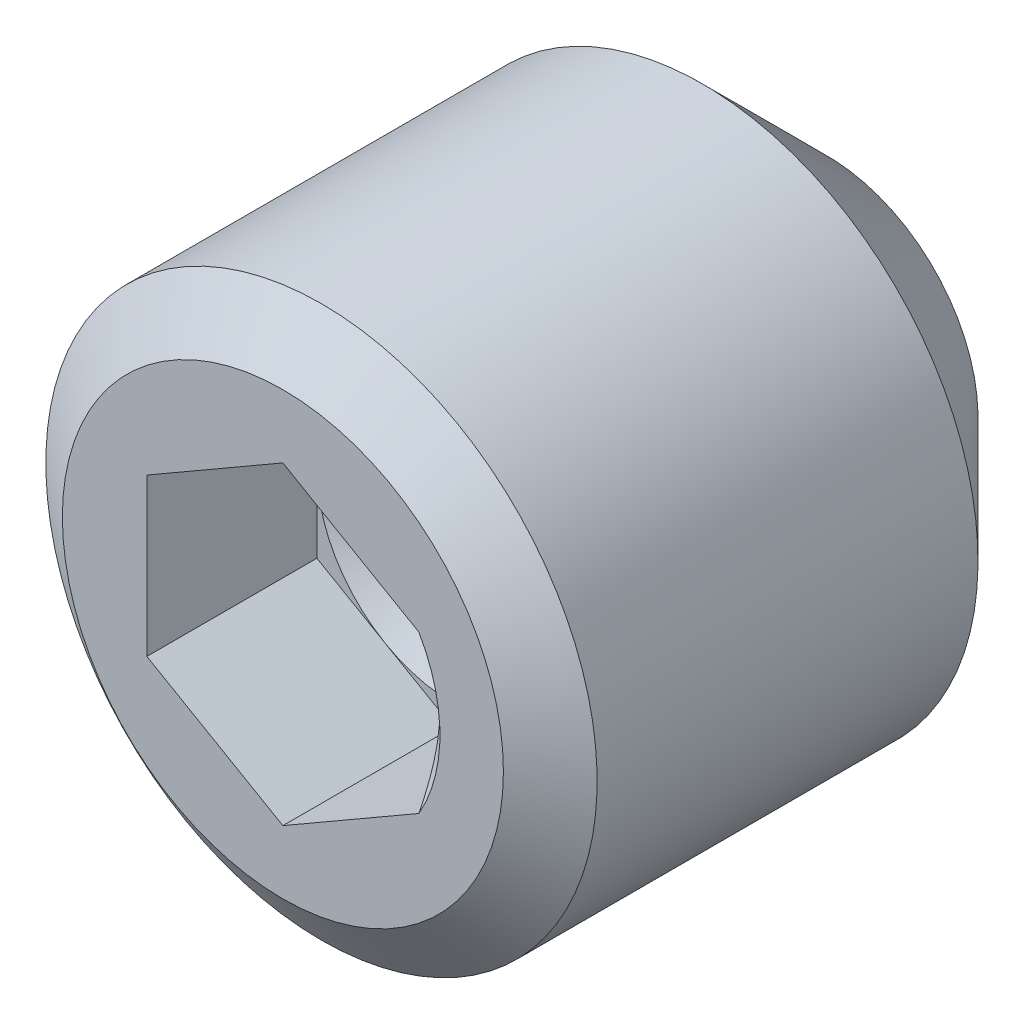
ISO-10303-21;
HEADER;
FILE_DESCRIPTION(('STEP AP214'),'2;1');
FILE_NAME('part.step','',(''),(''),'','','');
FILE_SCHEMA(('AUTOMOTIVE_DESIGN { 1 0 10303 214 1 1 1 1 }'));
ENDSEC;
DATA;
#1=APPLICATION_CONTEXT('core data for automotive mechanical design processes');
#2=APPLICATION_PROTOCOL_DEFINITION('international standard','automotive_design',2000,#1);
#3=PRODUCT_CONTEXT('',#1,'mechanical');
#4=PRODUCT('Part','Part','',(#3));
#5=PRODUCT_RELATED_PRODUCT_CATEGORY('part','',(#4));
#6=PRODUCT_DEFINITION_FORMATION('','',#4);
#7=PRODUCT_DEFINITION_CONTEXT('part definition',#1,'design');
#8=PRODUCT_DEFINITION('design','',#6,#7);
#9=PRODUCT_DEFINITION_SHAPE('','',#8);
#10=(LENGTH_UNIT() NAMED_UNIT(*) SI_UNIT(.MILLI.,.METRE.));
#11=(NAMED_UNIT(*) PLANE_ANGLE_UNIT() SI_UNIT($,.RADIAN.));
#12=(NAMED_UNIT(*) SI_UNIT($,.STERADIAN.) SOLID_ANGLE_UNIT());
#13=UNCERTAINTY_MEASURE_WITH_UNIT(LENGTH_MEASURE(1.E-05),#10,'distance_accuracy_value','');
#14=(GEOMETRIC_REPRESENTATION_CONTEXT(3) GLOBAL_UNCERTAINTY_ASSIGNED_CONTEXT((#13)) GLOBAL_UNIT_ASSIGNED_CONTEXT((#10,
#11,#12)) REPRESENTATION_CONTEXT('',''));
#15=CARTESIAN_POINT('',(0.,0.,0.));
#16=DIRECTION('',(0.,0.,1.));
#17=DIRECTION('',(1.,0.,0.));
#18=AXIS2_PLACEMENT_3D('',#15,#16,#17);
#19=CARTESIAN_POINT('',(-1.190625,2.06222299276171,0.49572798217451));
#20=DIRECTION('',(0.,0.,1.));
#21=DIRECTION('',(0.,-1.,0.));
#22=AXIS2_PLACEMENT_3D('',#19,#20,#21);
#23=PLANE('',#22);
#24=DIRECTION('',(-0.866025403784438,0.500000000000001,0.));
#25=VECTOR('',#24,1.);
#26=CARTESIAN_POINT('',(1.19062500000001,0.687407664253913,0.495727982174503));
#27=LINE('',#26,#25);
#28=CARTESIAN_POINT('',(1.19062500000003,0.687407664253898,0.495727982174509));
#29=VERTEX_POINT('',#28);
#30=CARTESIAN_POINT('',(0.595312500000009,1.03111149638086,0.495727982174503));
#31=VERTEX_POINT('',#30);
#32=EDGE_CURVE('E155',#29,#31,#27,.T.);
#33=ORIENTED_EDGE('',*,*,#32,.T.);
#34=CARTESIAN_POINT('',(0.,0.,0.495727981995239));
#35=DIRECTION('',(0.,0.,-1.));
#36=DIRECTION('',(0.,1.,0.));
#37=AXIS2_PLACEMENT_3D('',#34,#35,#36);
#38=CIRCLE('',#37,1.19062500010638);
#39=CARTESIAN_POINT('',(1.19062500010638,0.,0.495727981995239));
#40=VERTEX_POINT('',#39);
#41=EDGE_CURVE('E64',#31,#40,#38,.T.);
#42=ORIENTED_EDGE('',*,*,#41,.T.);
#43=DIRECTION('',(0.,1.,0.));
#44=VECTOR('',#43,1.);
#45=CARTESIAN_POINT('',(1.19062500000001,-0.687407664253889,0.495727982174509));
#46=LINE('',#45,#44);
#47=EDGE_CURVE('E339',#40,#29,#46,.T.);
#48=ORIENTED_EDGE('',*,*,#47,.T.);
#49=EDGE_LOOP('',(#33,#42,#48));
#50=FACE_BOUND('',#49,.T.);
#51=ADVANCED_FACE('F48',(#50),#23,.T.);
#52=CARTESIAN_POINT('',(1.19062500000001,-0.687407664253884,0.49572798217451));
#53=VERTEX_POINT('',#52);
#54=EDGE_CURVE('E125',#53,#40,#46,.T.);
#55=ORIENTED_EDGE('',*,*,#54,.T.);
#56=CARTESIAN_POINT('',(0.595312500053191,-1.03111149647298,0.495727981995239));
#57=VERTEX_POINT('',#56);
#58=EDGE_CURVE('E637',#40,#57,#38,.T.);
#59=ORIENTED_EDGE('',*,*,#58,.T.);
#60=DIRECTION('',(0.866025403784439,0.5,0.));
#61=VECTOR('',#60,1.);
#62=CARTESIAN_POINT('',(0.,-1.37481532850779,0.49572798217451));
#63=LINE('',#62,#61);
#64=EDGE_CURVE('E141',#57,#53,#63,.T.);
#65=ORIENTED_EDGE('',*,*,#64,.T.);
#66=EDGE_LOOP('',(#55,#59,#65));
#67=FACE_BOUND('',#66,.T.);
#68=ADVANCED_FACE('F328',(#67),#23,.T.);
#69=CARTESIAN_POINT('',(0.,-1.37481532850779,0.495727982174507));
#70=VERTEX_POINT('',#69);
#71=EDGE_CURVE('E132',#70,#57,#63,.T.);
#72=ORIENTED_EDGE('',*,*,#71,.T.);
#73=CARTESIAN_POINT('',(-0.595312500053192,-1.03111149647298,0.495727981995239));
#74=VERTEX_POINT('',#73);
#75=EDGE_CURVE('E638',#57,#74,#38,.T.);
#76=ORIENTED_EDGE('',*,*,#75,.T.);
#77=DIRECTION('',(0.866025403784438,-0.500000000000001,0.));
#78=VECTOR('',#77,1.);
#79=CARTESIAN_POINT('',(-1.190625,-0.687407664253889,0.495727982174503));
#80=LINE('',#79,#78);
#81=EDGE_CURVE('E189',#74,#70,#80,.T.);
#82=ORIENTED_EDGE('',*,*,#81,.T.);
#83=EDGE_LOOP('',(#72,#76,#82));
#84=FACE_BOUND('',#83,.T.);
#85=ADVANCED_FACE('F333',(#84),#23,.T.);
#86=CARTESIAN_POINT('',(-1.19062500000001,-0.687407664253882,0.49572798217451));
#87=VERTEX_POINT('',#86);
#88=EDGE_CURVE('E152',#87,#74,#80,.T.);
#89=ORIENTED_EDGE('',*,*,#88,.T.);
#90=CARTESIAN_POINT('',(-1.19062500010638,0.,0.495727981995239));
#91=VERTEX_POINT('',#90);
#92=EDGE_CURVE('E628',#74,#91,#38,.T.);
#93=ORIENTED_EDGE('',*,*,#92,.T.);
#94=DIRECTION('',(0.,-1.,0.));
#95=VECTOR('',#94,1.);
#96=CARTESIAN_POINT('',(-1.190625,0.687407664253913,0.49572798217451));
#97=LINE('',#96,#95);
#98=EDGE_CURVE('E124',#91,#87,#97,.T.);
#99=ORIENTED_EDGE('',*,*,#98,.T.);
#100=EDGE_LOOP('',(#89,#93,#99));
#101=FACE_BOUND('',#100,.T.);
#102=ADVANCED_FACE('F395',(#101),#23,.T.);
#103=CARTESIAN_POINT('',(-1.190625,0.687407664253916,0.495727982174502));
#104=VERTEX_POINT('',#103);
#105=EDGE_CURVE('E188',#104,#91,#97,.T.);
#106=ORIENTED_EDGE('',*,*,#105,.T.);
#107=CARTESIAN_POINT('',(-0.595312500053191,1.03111149647298,0.495727981995239));
#108=VERTEX_POINT('',#107);
#109=EDGE_CURVE('E593',#91,#108,#38,.T.);
#110=ORIENTED_EDGE('',*,*,#109,.T.);
#111=DIRECTION('',(-0.866025403784439,-0.5,0.));
#112=VECTOR('',#111,1.);
#113=CARTESIAN_POINT('',(0.,1.37481532850781,0.495727982174501));
#114=LINE('',#113,#112);
#115=EDGE_CURVE('E180',#108,#104,#114,.T.);
#116=ORIENTED_EDGE('',*,*,#115,.T.);
#117=EDGE_LOOP('',(#106,#110,#116));
#118=FACE_BOUND('',#117,.T.);
#119=ADVANCED_FACE('F317',(#118),#23,.T.);
#120=CARTESIAN_POINT('',(0.,1.37481532850782,0.495727982174503));
#121=VERTEX_POINT('',#120);
#122=EDGE_CURVE('E162',#121,#108,#114,.T.);
#123=ORIENTED_EDGE('',*,*,#122,.T.);
#124=EDGE_CURVE('E104',#108,#31,#38,.T.);
#125=ORIENTED_EDGE('',*,*,#124,.T.);
#126=EDGE_CURVE('E137',#31,#121,#27,.T.);
#127=ORIENTED_EDGE('',*,*,#126,.T.);
#128=EDGE_LOOP('',(#123,#125,#127));
#129=FACE_BOUND('',#128,.T.);
#130=ADVANCED_FACE('F319',(#129),#23,.T.);
#131=CARTESIAN_POINT('',(1.19062500000001,-0.687407664253889,0.49572798217451));
#132=DIRECTION('',(1.,0.,0.));
#133=DIRECTION('',(0.,1.,0.));
#134=AXIS2_PLACEMENT_3D('',#131,#132,#133);
#135=PLANE('',#134);
#136=CARTESIAN_POINT('',(1.19062499999567,0.687407664292412,1.98400923211493));
#137=CARTESIAN_POINT('',(1.19062499999845,0.64046328207789,1.96055894231477));
#138=CARTESIAN_POINT('',(1.19062499999959,0.592738991388445,1.9384779182468));
#139=CARTESIAN_POINT('',(1.19062500000044,0.495406225216116,1.89800295513959));
#140=CARTESIAN_POINT('',(1.19062500000013,0.44578762950972,1.87963356850329));
#141=CARTESIAN_POINT('',(1.1906249999999,0.345116375712698,1.84791358583569));
#142=CARTESIAN_POINT('',(1.19062499999999,0.294069215443057,1.83454600462254));
#143=CARTESIAN_POINT('',(1.19062500000004,0.190855854638069,1.81396603547193));
#144=CARTESIAN_POINT('',(1.19062500000002,0.138693632939681,1.80673461351588));
#145=CARTESIAN_POINT('',(1.19062500000001,0.0719511128628457,1.80190389372895));
#146=CARTESIAN_POINT('',(1.19062500000001,0.0575681065477679,1.80112291749238));
#147=CARTESIAN_POINT('',(1.19062500000001,0.0287907386471924,1.80008032792779));
#148=CARTESIAN_POINT('',(1.19062500000001,0.0143963874866042,1.79981843246661));
#149=CARTESIAN_POINT('',(1.19062500000001,-0.0361321030513867,1.79982008619966));
#150=CARTESIAN_POINT('',(1.19062500000001,-0.0722770331511759,1.80147394594884));
#151=CARTESIAN_POINT('',(1.19062500000001,-0.144284982609329,1.80799116289963));
#152=CARTESIAN_POINT('',(1.19062500000001,-0.180147787674807,1.81285675864882));
#153=CARTESIAN_POINT('',(1.19062500000001,-0.287258251714067,1.83196696983393));
#154=CARTESIAN_POINT('',(1.19062500000001,-0.35772529740189,1.85072176782421));
#155=CARTESIAN_POINT('',(1.19062500000001,-0.471552892507442,1.88908925370762));
#156=CARTESIAN_POINT('',(1.19062500000001,-0.515840765958847,1.90614997876308));
#157=CARTESIAN_POINT('',(1.19062500000001,-0.602739573147029,1.94312607455083));
#158=CARTESIAN_POINT('',(1.19062500000001,-0.645362139970547,1.96301390794479));
#159=CARTESIAN_POINT('',(1.19062500000001,-0.687407664293118,1.98400923211292));
#160=B_SPLINE_CURVE_WITH_KNOTS('',3,(#136,#137,#138,#139,#140,#141,#142,#143,#144,#145,#146,
#147,#148,#149,#150,#151,#152,#153,#154,#155,#156,#157,#158,#159),.UNSPECIFIED.,.F.,.F.,(4,2,2,
2,2,2,2,2,2,2,2,4),(0.,0.157535403142992,0.316081041540045,0.474083294698365,0.631593623243647,
0.674799715139207,0.717982317014592,0.826362160391399,0.934817623300469,1.15262451060987,
1.29491478060776,1.43590359051227),.UNSPECIFIED.);
#161=CARTESIAN_POINT('',(1.19062500005789,0.687407664240221,1.98400923213658));
#162=VERTEX_POINT('',#161);
#163=CARTESIAN_POINT('',(1.19062500002894,-0.687407664270611,1.98400923212671));
#164=VERTEX_POINT('',#163);
#165=EDGE_CURVE('E118',#162,#164,#160,.T.);
#166=ORIENTED_EDGE('',*,*,#165,.F.);
#167=DIRECTION('',(0.,0.,1.));
#168=VECTOR('',#167,1.);
#169=CARTESIAN_POINT('',(1.19062500000003,0.687407664253898,0.49572798217451));
#170=LINE('',#169,#168);
#171=EDGE_CURVE('E159',#162,#29,#170,.F.);
#172=ORIENTED_EDGE('',*,*,#171,.T.);
#173=ORIENTED_EDGE('',*,*,#47,.F.);
#174=ORIENTED_EDGE('',*,*,#54,.F.);
#175=DIRECTION('',(0.,0.,1.));
#176=VECTOR('',#175,1.);
#177=CARTESIAN_POINT('',(1.19062500000001,-0.687407664253884,0.49572798217451));
#178=LINE('',#177,#176);
#179=EDGE_CURVE('E98',#53,#164,#178,.T.);
#180=ORIENTED_EDGE('',*,*,#179,.T.);
#181=EDGE_LOOP('',(#166,#172,#173,#174,#180));
#182=FACE_BOUND('',#181,.T.);
#183=ADVANCED_FACE('F128',(#182),#135,.F.);
#184=CARTESIAN_POINT('',(-1.190625,0.687407664253913,0.495727982174503));
#185=DIRECTION('',(-1.,0.,0.));
#186=DIRECTION('',(0.,-1.,0.));
#187=AXIS2_PLACEMENT_3D('',#184,#185,#186);
#188=PLANE('',#187);
#189=DIRECTION('',(0.,0.,1.));
#190=VECTOR('',#189,1.);
#191=CARTESIAN_POINT('',(-1.190625,0.687407664253916,0.495727982174503));
#192=LINE('',#191,#190);
#193=CARTESIAN_POINT('',(-1.19062500002893,0.687407664270642,1.98400923212671));
#194=VERTEX_POINT('',#193);
#195=EDGE_CURVE('E286',#104,#194,#192,.T.);
#196=ORIENTED_EDGE('',*,*,#195,.T.);
#197=DIRECTION('',(0.,1.,0.));
#198=VECTOR('',#197,1.);
#199=CARTESIAN_POINT('',(-1.190625,0.,1.98400923217451));
#200=LINE('',#199,#198);
#201=CARTESIAN_POINT('',(-1.19062500005789,-0.687407664241365,1.98400923213716));
#202=VERTEX_POINT('',#201);
#203=EDGE_CURVE('E105',#194,#202,#200,.F.);
#204=ORIENTED_EDGE('',*,*,#203,.T.);
#205=DIRECTION('',(0.,0.,1.));
#206=VECTOR('',#205,1.);
#207=CARTESIAN_POINT('',(-1.19062500000001,-0.687407664253882,0.49572798217451));
#208=LINE('',#207,#206);
#209=EDGE_CURVE('E148',#202,#87,#208,.F.);
#210=ORIENTED_EDGE('',*,*,#209,.T.);
#211=ORIENTED_EDGE('',*,*,#98,.F.);
#212=ORIENTED_EDGE('',*,*,#105,.F.);
#213=EDGE_LOOP('',(#196,#204,#210,#211,#212));
#214=FACE_BOUND('',#213,.T.);
#215=ADVANCED_FACE('F265',(#214),#188,.F.);
#216=CARTESIAN_POINT('',(-1.190625,-0.687407664253889,0.49572798217451));
#217=DIRECTION('',(-0.500000000000001,-0.866025403784438,0.));
#218=DIRECTION('',(0.866025403784438,-0.500000000000001,0.));
#219=AXIS2_PLACEMENT_3D('',#216,#217,#218);
#220=PLANE('',#219);
#221=ORIENTED_EDGE('',*,*,#209,.F.);
#222=DIRECTION('',(-0.866025403784438,0.500000000000001,0.));
#223=VECTOR('',#222,1.);
#224=CARTESIAN_POINT('',(-0.595312499999992,-1.03111149638084,1.98400923217452));
#225=LINE('',#224,#223);
#226=CARTESIAN_POINT('',(-3.97893484739274E-11,-1.37481532855166,1.98400923213716));
#227=VERTEX_POINT('',#226);
#228=EDGE_CURVE('E609',#202,#227,#225,.F.);
#229=ORIENTED_EDGE('',*,*,#228,.T.);
#230=DIRECTION('',(0.,0.,1.));
#231=VECTOR('',#230,1.);
#232=CARTESIAN_POINT('',(0.,-1.3748153285078,0.49572798217451));
#233=LINE('',#232,#231);
#234=EDGE_CURVE('E101',#227,#70,#233,.F.);
#235=ORIENTED_EDGE('',*,*,#234,.T.);
#236=ORIENTED_EDGE('',*,*,#81,.F.);
#237=ORIENTED_EDGE('',*,*,#88,.F.);
#238=EDGE_LOOP('',(#221,#229,#235,#236,#237));
#239=FACE_BOUND('',#238,.T.);
#240=ADVANCED_FACE('F260',(#239),#220,.F.);
#241=CARTESIAN_POINT('',(0.,-1.37481532850779,0.49572798217451));
#242=DIRECTION('',(0.5,-0.866025403784439,0.));
#243=DIRECTION('',(0.866025403784439,0.5,0.));
#244=AXIS2_PLACEMENT_3D('',#241,#242,#243);
#245=PLANE('',#244);
#246=ORIENTED_EDGE('',*,*,#234,.F.);
#247=DIRECTION('',(-0.866025403784439,-0.5,0.));
#248=VECTOR('',#247,1.);
#249=CARTESIAN_POINT('',(0.595312500000002,-1.03111149638084,1.98400923217452));
#250=LINE('',#249,#248);
#251=EDGE_CURVE('E93',#227,#164,#250,.F.);
#252=ORIENTED_EDGE('',*,*,#251,.T.);
#253=ORIENTED_EDGE('',*,*,#179,.F.);
#254=ORIENTED_EDGE('',*,*,#64,.F.);
#255=ORIENTED_EDGE('',*,*,#71,.F.);
#256=EDGE_LOOP('',(#246,#252,#253,#254,#255));
#257=FACE_BOUND('',#256,.T.);
#258=ADVANCED_FACE('F95',(#257),#245,.F.);
#259=CARTESIAN_POINT('',(1.19062500000001,0.687407664253913,0.49572798217451));
#260=DIRECTION('',(0.500000000000001,0.866025403784438,0.));
#261=DIRECTION('',(-0.866025403784438,0.500000000000001,0.));
#262=AXIS2_PLACEMENT_3D('',#259,#260,#261);
#263=PLANE('',#262);
#264=ORIENTED_EDGE('',*,*,#171,.F.);
#265=DIRECTION('',(0.866025403784438,-0.500000000000001,0.));
#266=VECTOR('',#265,1.);
#267=CARTESIAN_POINT('',(0.595312500000015,1.03111149638086,1.98400923217451));
#268=LINE('',#267,#266);
#269=CARTESIAN_POINT('',(3.97830493977745E-11,1.37481532855168,1.98400923213717));
#270=VERTEX_POINT('',#269);
#271=EDGE_CURVE('E111',#162,#270,#268,.F.);
#272=ORIENTED_EDGE('',*,*,#271,.T.);
#273=DIRECTION('',(0.,0.,1.));
#274=VECTOR('',#273,1.);
#275=CARTESIAN_POINT('',(0.,1.37481532850782,0.495727982174503));
#276=LINE('',#275,#274);
#277=EDGE_CURVE('E116',#270,#121,#276,.F.);
#278=ORIENTED_EDGE('',*,*,#277,.T.);
#279=ORIENTED_EDGE('',*,*,#126,.F.);
#280=ORIENTED_EDGE('',*,*,#32,.F.);
#281=EDGE_LOOP('',(#264,#272,#278,#279,#280));
#282=FACE_BOUND('',#281,.T.);
#283=ADVANCED_FACE('F342',(#282),#263,.F.);
#284=CARTESIAN_POINT('',(0.,1.37481532850781,0.495727982174503));
#285=DIRECTION('',(-0.5,0.866025403784439,0.));
#286=DIRECTION('',(-0.866025403784439,-0.5,0.));
#287=AXIS2_PLACEMENT_3D('',#284,#285,#286);
#288=PLANE('',#287);
#289=ORIENTED_EDGE('',*,*,#277,.F.);
#290=DIRECTION('',(0.866025403784439,0.5,0.));
#291=VECTOR('',#290,1.);
#292=CARTESIAN_POINT('',(-0.595312500000002,1.03111149638086,1.98400923217451));
#293=LINE('',#292,#291);
#294=EDGE_CURVE('E73',#270,#194,#293,.F.);
#295=ORIENTED_EDGE('',*,*,#294,.T.);
#296=ORIENTED_EDGE('',*,*,#195,.F.);
#297=ORIENTED_EDGE('',*,*,#115,.F.);
#298=ORIENTED_EDGE('',*,*,#122,.F.);
#299=EDGE_LOOP('',(#289,#295,#296,#297,#298));
#300=FACE_BOUND('',#299,.T.);
#301=ADVANCED_FACE('F240',(#300),#288,.F.);
#302=CARTESIAN_POINT('',(0.,0.,1.98400923216013));
#303=DIRECTION('',(0.,0.,1.));
#304=DIRECTION('',(1.,0.,0.));
#305=AXIS2_PLACEMENT_3D('',#302,#303,#304);
#306=CONICAL_SURFACE('',#305,1.37481532857464,0.785398163550834);
#307=CARTESIAN_POINT('',(0.,0.,1.98400923216013));
#308=DIRECTION('',(0.,0.,1.));
#309=DIRECTION('',(1.,0.,0.));
#310=AXIS2_PLACEMENT_3D('',#307,#308,#309);
#311=CIRCLE('',#310,1.37481532857464);
#312=EDGE_CURVE('E108',#164,#162,#311,.T.);
#313=ORIENTED_EDGE('',*,*,#312,.T.);
#314=ORIENTED_EDGE('',*,*,#165,.T.);
#315=EDGE_LOOP('',(#313,#314));
#316=FACE_BOUND('',#315,.T.);
#317=ADVANCED_FACE('F119',(#316),#306,.F.);
#318=CARTESIAN_POINT('',(0.,1.32223931889029,-2.77849076782551));
#319=DIRECTION('',(0.,0.,1.));
#320=DIRECTION('',(0.,-1.,0.));
#321=AXIS2_PLACEMENT_3D('',#318,#319,#320);
#322=PLANE('',#321);
#323=CARTESIAN_POINT('',(0.,0.,-2.77849076780968));
#324=DIRECTION('',(0.,0.,1.));
#325=DIRECTION('',(0.,-1.,0.));
#326=AXIS2_PLACEMENT_3D('',#323,#324,#325);
#327=CIRCLE('',#326,1.3222393188812);
#328=CARTESIAN_POINT('',(0.,-1.3222393188812,-2.77849076780967));
#329=VERTEX_POINT('',#328);
#330=EDGE_CURVE('E115',#329,#329,#327,.T.);
#331=ORIENTED_EDGE('',*,*,#330,.F.);
#332=EDGE_LOOP('',(#331));
#333=FACE_BOUND('',#332,.T.);
#334=ADVANCED_FACE('F301',(#333),#322,.F.);
#335=CARTESIAN_POINT('',(0.,0.,1.98400923217451));
#336=DIRECTION('',(0.,0.,-1.));
#337=DIRECTION('',(0.,1.,0.));
#338=AXIS2_PLACEMENT_3D('',#335,#336,#337);
#339=PLANE('',#338);
#340=CARTESIAN_POINT('',(0.,0.,1.98400923217451));
#341=DIRECTION('',(0.,0.,-1.));
#342=DIRECTION('',(0.,1.,0.));
#343=AXIS2_PLACEMENT_3D('',#340,#341,#342);
#344=CIRCLE('',#343,1.93040000006006);
#345=CARTESIAN_POINT('',(0.,1.93040000006008,1.9840092321745));
#346=VERTEX_POINT('',#345);
#347=EDGE_CURVE('E13',#346,#346,#344,.F.);
#348=ORIENTED_EDGE('',*,*,#347,.T.);
#349=EDGE_LOOP('',(#348));
#350=FACE_BOUND('',#349,.T.);
#351=ORIENTED_EDGE('',*,*,#228,.F.);
#352=ORIENTED_EDGE('',*,*,#203,.F.);
#353=ORIENTED_EDGE('',*,*,#294,.F.);
#354=ORIENTED_EDGE('',*,*,#271,.F.);
#355=ORIENTED_EDGE('',*,*,#312,.F.);
#356=ORIENTED_EDGE('',*,*,#251,.F.);
#357=EDGE_LOOP('',(#351,#352,#353,#354,#355,#356));
#358=FACE_BOUND('',#357,.T.);
#359=ADVANCED_FACE('F110',(#350,#358),#339,.F.);
#360=CARTESIAN_POINT('',(0.,0.,-1.68773008670088));
#361=DIRECTION('',(0.,0.,1.));
#362=DIRECTION('',(0.,-1.,0.));
#363=AXIS2_PLACEMENT_3D('',#360,#361,#362);
#364=CONICAL_SURFACE('',#363,2.41299999993317,0.785398163371396);
#365=CARTESIAN_POINT('',(0.,0.,-1.68773008671579));
#366=DIRECTION('',(0.,0.,1.));
#367=DIRECTION('',(0.,-1.,0.));
#368=AXIS2_PLACEMENT_3D('',#365,#366,#367);
#369=CIRCLE('',#368,2.41299999999999);
#370=CARTESIAN_POINT('',(0.,-2.41299999999999,-1.68773008671578));
#371=VERTEX_POINT('',#370);
#372=EDGE_CURVE('E201',#371,#371,#369,.T.);
#373=ORIENTED_EDGE('',*,*,#372,.F.);
#374=EDGE_LOOP('',(#373));
#375=FACE_BOUND('',#374,.T.);
#376=ORIENTED_EDGE('',*,*,#330,.T.);
#377=EDGE_LOOP('',(#376));
#378=FACE_BOUND('',#377,.T.);
#379=ADVANCED_FACE('F307',(#375,#378),#364,.T.);
#380=CARTESIAN_POINT('',(0.,0.,-1.9840092321745));
#381=DIRECTION('',(0.,0.,1.));
#382=DIRECTION('',(0.,-1.,0.));
#383=AXIS2_PLACEMENT_3D('',#380,#381,#382);
#384=CYLINDRICAL_SURFACE('',#383,2.41299999999999);
#385=CARTESIAN_POINT('',(0.,0.,1.64608907425465));
#386=DIRECTION('',(0.,0.,-1.));
#387=DIRECTION('',(0.,1.,0.));
#388=AXIS2_PLACEMENT_3D('',#385,#386,#387);
#389=CIRCLE('',#388,2.41299999999999);
#390=CARTESIAN_POINT('',(0.,2.41300000000001,1.64608907425464));
#391=VERTEX_POINT('',#390);
#392=EDGE_CURVE('E57',#391,#391,#389,.T.);
#393=ORIENTED_EDGE('',*,*,#392,.T.);
#394=EDGE_LOOP('',(#393));
#395=FACE_BOUND('',#394,.T.);
#396=ORIENTED_EDGE('',*,*,#372,.T.);
#397=EDGE_LOOP('',(#396));
#398=FACE_BOUND('',#397,.T.);
#399=ADVANCED_FACE('F311',(#395,#398),#384,.T.);
#400=CARTESIAN_POINT('',(0.,0.,-0.19167968232008));
#401=DIRECTION('',(0.,0.,1.));
#402=DIRECTION('',(0.,-1.,0.));
#403=AXIS2_PLACEMENT_3D('',#400,#401,#402);
#404=CONICAL_SURFACE('',#403,0.,1.0471975511966);
#405=ORIENTED_EDGE('',*,*,#41,.F.);
#406=ORIENTED_EDGE('',*,*,#124,.F.);
#407=ORIENTED_EDGE('',*,*,#109,.F.);
#408=ORIENTED_EDGE('',*,*,#92,.F.);
#409=ORIENTED_EDGE('',*,*,#75,.F.);
#410=ORIENTED_EDGE('',*,*,#58,.F.);
#411=EDGE_LOOP('',(#405,#406,#407,#408,#409,#410));
#412=FACE_BOUND('',#411,.T.);
#413=CARTESIAN_POINT('',(0.,0.,-0.19167968232008));
#414=VERTEX_POINT('',#413);
#415=VERTEX_LOOP('',#414);
#416=FACE_BOUND('',#415,.T.);
#417=ADVANCED_FACE('F315',(#412,#416),#404,.F.);
#418=CARTESIAN_POINT('',(0.,0.,1.64608907425465));
#419=DIRECTION('',(0.,0.,-1.));
#420=DIRECTION('',(0.,1.,0.));
#421=AXIS2_PLACEMENT_3D('',#418,#419,#420);
#422=CONICAL_SURFACE('',#421,2.41299999999999,0.959931088566414);
#423=ORIENTED_EDGE('',*,*,#347,.F.);
#424=EDGE_LOOP('',(#423));
#425=FACE_BOUND('',#424,.T.);
#426=ORIENTED_EDGE('',*,*,#392,.F.);
#427=EDGE_LOOP('',(#426));
#428=FACE_BOUND('',#427,.T.);
#429=ADVANCED_FACE('F51',(#425,#428),#422,.T.);
#430=CLOSED_SHELL('',(#51,#68,#85,#102,#119,#130,#183,#215,#240,#258,#283,#301,#317,#334,#359,
#379,#399,#417,#429));
#431=MANIFOLD_SOLID_BREP('B2',#430);
#432=ADVANCED_BREP_SHAPE_REPRESENTATION('',(#18,#431),#14);
#433=SHAPE_DEFINITION_REPRESENTATION(#9,#432);
ENDSEC;
END-ISO-10303-21;
